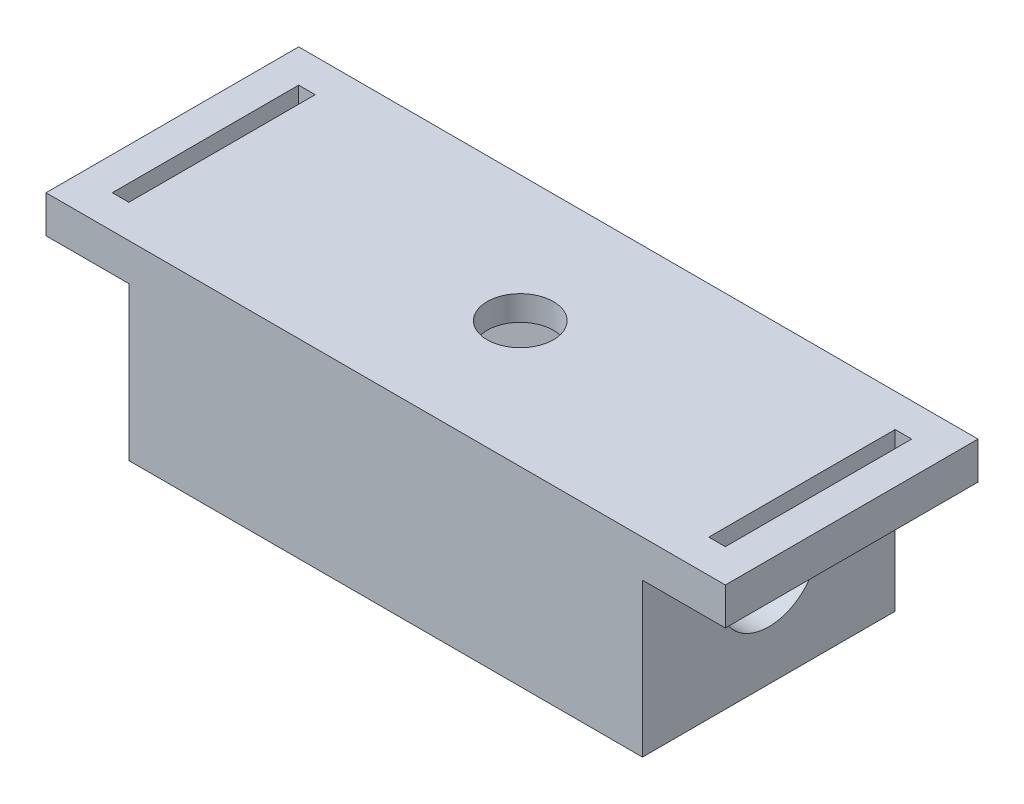
ISO-10303-21;
HEADER;
FILE_DESCRIPTION(('STEP AP214'),'2;1');
FILE_NAME('part.step','',(''),(''),'','','');
FILE_SCHEMA(('AUTOMOTIVE_DESIGN { 1 0 10303 214 1 1 1 1 }'));
ENDSEC;
DATA;
#1=APPLICATION_CONTEXT('core data for automotive mechanical design processes');
#2=APPLICATION_PROTOCOL_DEFINITION('international standard','automotive_design',2000,#1);
#3=PRODUCT_CONTEXT('',#1,'mechanical');
#4=PRODUCT('Part','Part','',(#3));
#5=PRODUCT_RELATED_PRODUCT_CATEGORY('part','',(#4));
#6=PRODUCT_DEFINITION_FORMATION('','',#4);
#7=PRODUCT_DEFINITION_CONTEXT('part definition',#1,'design');
#8=PRODUCT_DEFINITION('design','',#6,#7);
#9=PRODUCT_DEFINITION_SHAPE('','',#8);
#10=(LENGTH_UNIT() NAMED_UNIT(*) SI_UNIT(.MILLI.,.METRE.));
#11=(NAMED_UNIT(*) PLANE_ANGLE_UNIT() SI_UNIT($,.RADIAN.));
#12=(NAMED_UNIT(*) SI_UNIT($,.STERADIAN.) SOLID_ANGLE_UNIT());
#13=UNCERTAINTY_MEASURE_WITH_UNIT(LENGTH_MEASURE(1.E-05),#10,'distance_accuracy_value','');
#14=(GEOMETRIC_REPRESENTATION_CONTEXT(3) GLOBAL_UNCERTAINTY_ASSIGNED_CONTEXT((#13)) GLOBAL_UNIT_ASSIGNED_CONTEXT((#10,
#11,#12)) REPRESENTATION_CONTEXT('',''));
#15=CARTESIAN_POINT('',(0.,0.,0.));
#16=DIRECTION('',(0.,0.,1.));
#17=DIRECTION('',(1.,0.,0.));
#18=AXIS2_PLACEMENT_3D('',#15,#16,#17);
#19=CARTESIAN_POINT('',(-24.6129032258065,27.,22.9616935483871));
#20=DIRECTION('',(1.,0.,0.));
#21=DIRECTION('',(0.,0.,-1.));
#22=AXIS2_PLACEMENT_3D('',#19,#20,#21);
#23=PLANE('',#22);
#24=DIRECTION('',(0.,0.,-1.));
#25=VECTOR('',#24,1.);
#26=CARTESIAN_POINT('',(-24.6129032258065,4.,22.9616935483871));
#27=LINE('',#26,#25);
#28=CARTESIAN_POINT('',(-24.6129032258065,4.,-3.53830645161289));
#29=VERTEX_POINT('',#28);
#30=CARTESIAN_POINT('',(-24.6129032258065,4.,-7.5383064516129));
#31=VERTEX_POINT('',#30);
#32=EDGE_CURVE('E178',#29,#31,#27,.T.);
#33=ORIENTED_EDGE('',*,*,#32,.F.);
#34=DIRECTION('',(0.,-1.,0.));
#35=VECTOR('',#34,1.);
#36=CARTESIAN_POINT('',(-24.6129032258065,27.,-3.5383064516129));
#37=LINE('',#36,#35);
#38=CARTESIAN_POINT('',(-24.6129032258065,22.5,-3.5383064516129));
#39=VERTEX_POINT('',#38);
#40=EDGE_CURVE('E224',#39,#29,#37,.T.);
#41=ORIENTED_EDGE('',*,*,#40,.F.);
#42=DIRECTION('',(0.,0.,1.));
#43=VECTOR('',#42,1.);
#44=CARTESIAN_POINT('',(-24.6129032258065,22.5,-7.5383064516129));
#45=LINE('',#44,#43);
#46=CARTESIAN_POINT('',(-24.6129032258065,22.5,-7.5383064516129));
#47=VERTEX_POINT('',#46);
#48=EDGE_CURVE('E44',#47,#39,#45,.T.);
#49=ORIENTED_EDGE('',*,*,#48,.F.);
#50=DIRECTION('',(0.,-1.,0.));
#51=VECTOR('',#50,1.);
#52=CARTESIAN_POINT('',(-24.6129032258065,27.,-7.5383064516129));
#53=LINE('',#52,#51);
#54=EDGE_CURVE('E193',#47,#31,#53,.T.);
#55=ORIENTED_EDGE('',*,*,#54,.T.);
#56=EDGE_LOOP('',(#33,#41,#49,#55));
#57=FACE_BOUND('',#56,.T.);
#58=ADVANCED_FACE('F33',(#57),#23,.F.);
#59=CARTESIAN_POINT('',(-24.6129032258065,4.,22.9616935483871));
#60=VERTEX_POINT('',#59);
#61=CARTESIAN_POINT('',(-24.6129032258065,4.,18.9616935483871));
#62=VERTEX_POINT('',#61);
#63=EDGE_CURVE('E187',#60,#62,#27,.T.);
#64=ORIENTED_EDGE('',*,*,#63,.F.);
#65=DIRECTION('',(0.,-1.,0.));
#66=VECTOR('',#65,1.);
#67=CARTESIAN_POINT('',(-24.6129032258065,27.,22.9616935483871));
#68=LINE('',#67,#66);
#69=CARTESIAN_POINT('',(-24.6129032258065,22.5,22.9616935483871));
#70=VERTEX_POINT('',#69);
#71=EDGE_CURVE('E199',#70,#60,#68,.T.);
#72=ORIENTED_EDGE('',*,*,#71,.F.);
#73=CARTESIAN_POINT('',(-24.6129032258065,22.5,18.9616935483871));
#74=VERTEX_POINT('',#73);
#75=EDGE_CURVE('E11',#74,#70,#45,.T.);
#76=ORIENTED_EDGE('',*,*,#75,.F.);
#77=DIRECTION('',(0.,-1.,0.));
#78=VECTOR('',#77,1.);
#79=CARTESIAN_POINT('',(-24.6129032258065,27.,18.9616935483871));
#80=LINE('',#79,#78);
#81=EDGE_CURVE('E234',#74,#62,#80,.T.);
#82=ORIENTED_EDGE('',*,*,#81,.T.);
#83=EDGE_LOOP('',(#64,#72,#76,#82));
#84=FACE_BOUND('',#83,.T.);
#85=ADVANCED_FACE('F268',(#84),#23,.F.);
#86=CARTESIAN_POINT('',(37.3870967741935,27.,-7.5383064516129));
#87=DIRECTION('',(-1.,0.,0.));
#88=DIRECTION('',(0.,0.,1.));
#89=AXIS2_PLACEMENT_3D('',#86,#87,#88);
#90=PLANE('',#89);
#91=CARTESIAN_POINT('',(37.3870967741935,16.,7.7116935483871));
#92=DIRECTION('',(-1.,0.,0.));
#93=DIRECTION('',(0.,0.,1.));
#94=AXIS2_PLACEMENT_3D('',#91,#92,#93);
#95=CIRCLE('',#94,6.);
#96=CARTESIAN_POINT('',(37.3870967741935,16.,13.7116935483871));
#97=VERTEX_POINT('',#96);
#98=EDGE_CURVE('E37',#97,#97,#95,.T.);
#99=ORIENTED_EDGE('',*,*,#98,.T.);
#100=EDGE_LOOP('',(#99));
#101=FACE_BOUND('',#100,.T.);
#102=DIRECTION('',(0.,0.,1.));
#103=VECTOR('',#102,1.);
#104=CARTESIAN_POINT('',(37.3870967741935,4.,22.9616935483871));
#105=LINE('',#104,#103);
#106=CARTESIAN_POINT('',(37.3870967741935,4.,-7.5383064516129));
#107=VERTEX_POINT('',#106);
#108=CARTESIAN_POINT('',(37.3870967741935,4.,22.9616935483871));
#109=VERTEX_POINT('',#108);
#110=EDGE_CURVE('E52',#107,#109,#105,.T.);
#111=ORIENTED_EDGE('',*,*,#110,.F.);
#112=DIRECTION('',(0.,-1.,0.));
#113=VECTOR('',#112,1.);
#114=CARTESIAN_POINT('',(37.3870967741935,27.,-7.5383064516129));
#115=LINE('',#114,#113);
#116=CARTESIAN_POINT('',(37.3870967741935,22.5,-7.5383064516129));
#117=VERTEX_POINT('',#116);
#118=EDGE_CURVE('E196',#117,#107,#115,.T.);
#119=ORIENTED_EDGE('',*,*,#118,.F.);
#120=DIRECTION('',(0.,0.,-1.));
#121=VECTOR('',#120,1.);
#122=CARTESIAN_POINT('',(37.3870967741935,22.5,-7.5383064516129));
#123=LINE('',#122,#121);
#124=CARTESIAN_POINT('',(37.3870967741935,22.5,22.9616935483871));
#125=VERTEX_POINT('',#124);
#126=EDGE_CURVE('E614',#125,#117,#123,.T.);
#127=ORIENTED_EDGE('',*,*,#126,.F.);
#128=DIRECTION('',(0.,-1.,0.));
#129=VECTOR('',#128,1.);
#130=CARTESIAN_POINT('',(37.3870967741935,27.,22.9616935483871));
#131=LINE('',#130,#129);
#132=EDGE_CURVE('E243',#125,#109,#131,.T.);
#133=ORIENTED_EDGE('',*,*,#132,.T.);
#134=EDGE_LOOP('',(#111,#119,#127,#133));
#135=FACE_BOUND('',#134,.T.);
#136=ADVANCED_FACE('F273',(#101,#135),#90,.F.);
#137=CARTESIAN_POINT('',(-24.6129032258065,27.,18.9616935483871));
#138=DIRECTION('',(0.,0.,-1.));
#139=DIRECTION('',(-1.,0.,0.));
#140=AXIS2_PLACEMENT_3D('',#137,#138,#139);
#141=PLANE('',#140);
#142=DIRECTION('',(0.,-1.,0.));
#143=VECTOR('',#142,1.);
#144=CARTESIAN_POINT('',(33.3870967741935,27.,18.9616935483871));
#145=LINE('',#144,#143);
#146=CARTESIAN_POINT('',(33.3870967741935,24.,18.9616935483871));
#147=VERTEX_POINT('',#146);
#148=CARTESIAN_POINT('',(33.3870967741935,4.,18.9616935483871));
#149=VERTEX_POINT('',#148);
#150=EDGE_CURVE('E231',#147,#149,#145,.T.);
#151=ORIENTED_EDGE('',*,*,#150,.T.);
#152=DIRECTION('',(-1.,0.,0.));
#153=VECTOR('',#152,1.);
#154=CARTESIAN_POINT('',(-24.6129032258065,4.,18.9616935483871));
#155=LINE('',#154,#153);
#156=EDGE_CURVE('E535',#149,#62,#155,.T.);
#157=ORIENTED_EDGE('',*,*,#156,.T.);
#158=ORIENTED_EDGE('',*,*,#81,.F.);
#159=CARTESIAN_POINT('',(-24.6129032258065,24.,18.9616935483871));
#160=VERTEX_POINT('',#159);
#161=EDGE_CURVE('E235',#160,#74,#80,.T.);
#162=ORIENTED_EDGE('',*,*,#161,.F.);
#163=DIRECTION('',(1.,0.,0.));
#164=VECTOR('',#163,1.);
#165=CARTESIAN_POINT('',(-24.6129032258065,24.,18.9616935483871));
#166=LINE('',#165,#164);
#167=EDGE_CURVE('E218',#160,#147,#166,.T.);
#168=ORIENTED_EDGE('',*,*,#167,.T.);
#169=EDGE_LOOP('',(#151,#157,#158,#162,#168));
#170=FACE_BOUND('',#169,.T.);
#171=ADVANCED_FACE('F431',(#170),#141,.T.);
#172=CARTESIAN_POINT('',(33.3870967741935,27.,-3.5383064516129));
#173=DIRECTION('',(-1.,0.,0.));
#174=DIRECTION('',(0.,0.,1.));
#175=AXIS2_PLACEMENT_3D('',#172,#173,#174);
#176=PLANE('',#175);
#177=CARTESIAN_POINT('',(33.3870967741935,16.,7.7116935483871));
#178=DIRECTION('',(-1.,0.,0.));
#179=DIRECTION('',(0.,0.,1.));
#180=AXIS2_PLACEMENT_3D('',#177,#178,#179);
#181=CIRCLE('',#180,6.);
#182=CARTESIAN_POINT('',(33.3870967741935,16.,13.7116935483871));
#183=VERTEX_POINT('',#182);
#184=EDGE_CURVE('E203',#183,#183,#181,.T.);
#185=ORIENTED_EDGE('',*,*,#184,.F.);
#186=EDGE_LOOP('',(#185));
#187=FACE_BOUND('',#186,.T.);
#188=DIRECTION('',(0.,-1.,0.));
#189=VECTOR('',#188,1.);
#190=CARTESIAN_POINT('',(33.3870967741935,27.,-3.5383064516129));
#191=LINE('',#190,#189);
#192=CARTESIAN_POINT('',(33.3870967741935,24.,-3.5383064516129));
#193=VERTEX_POINT('',#192);
#194=CARTESIAN_POINT('',(33.3870967741935,4.,-3.5383064516129));
#195=VERTEX_POINT('',#194);
#196=EDGE_CURVE('E228',#193,#195,#191,.T.);
#197=ORIENTED_EDGE('',*,*,#196,.T.);
#198=DIRECTION('',(0.,0.,1.));
#199=VECTOR('',#198,1.);
#200=CARTESIAN_POINT('',(33.3870967741935,4.,-3.5383064516129));
#201=LINE('',#200,#199);
#202=EDGE_CURVE('E532',#195,#149,#201,.T.);
#203=ORIENTED_EDGE('',*,*,#202,.T.);
#204=ORIENTED_EDGE('',*,*,#150,.F.);
#205=DIRECTION('',(0.,0.,-1.));
#206=VECTOR('',#205,1.);
#207=CARTESIAN_POINT('',(33.3870967741935,24.,-3.5383064516129));
#208=LINE('',#207,#206);
#209=EDGE_CURVE('E215',#147,#193,#208,.T.);
#210=ORIENTED_EDGE('',*,*,#209,.T.);
#211=EDGE_LOOP('',(#197,#203,#204,#210));
#212=FACE_BOUND('',#211,.T.);
#213=ADVANCED_FACE('F423',(#187,#212),#176,.T.);
#214=CARTESIAN_POINT('',(-24.6129032258065,27.,-3.5383064516129));
#215=DIRECTION('',(0.,0.,1.));
#216=DIRECTION('',(1.,0.,0.));
#217=AXIS2_PLACEMENT_3D('',#214,#215,#216);
#218=PLANE('',#217);
#219=ORIENTED_EDGE('',*,*,#40,.T.);
#220=DIRECTION('',(1.,0.,0.));
#221=VECTOR('',#220,1.);
#222=CARTESIAN_POINT('',(-24.6129032258065,4.,-3.5383064516129));
#223=LINE('',#222,#221);
#224=EDGE_CURVE('E183',#29,#195,#223,.T.);
#225=ORIENTED_EDGE('',*,*,#224,.T.);
#226=ORIENTED_EDGE('',*,*,#196,.F.);
#227=DIRECTION('',(-1.,0.,0.));
#228=VECTOR('',#227,1.);
#229=CARTESIAN_POINT('',(-24.6129032258065,24.,-3.5383064516129));
#230=LINE('',#229,#228);
#231=CARTESIAN_POINT('',(-24.6129032258065,24.,-3.5383064516129));
#232=VERTEX_POINT('',#231);
#233=EDGE_CURVE('E42',#193,#232,#230,.T.);
#234=ORIENTED_EDGE('',*,*,#233,.T.);
#235=EDGE_CURVE('E225',#232,#39,#37,.T.);
#236=ORIENTED_EDGE('',*,*,#235,.T.);
#237=EDGE_LOOP('',(#219,#225,#226,#234,#236));
#238=FACE_BOUND('',#237,.T.);
#239=ADVANCED_FACE('F417',(#238),#218,.T.);
#240=CARTESIAN_POINT('',(-28.6129032258065,27.,-7.5383064516129));
#241=DIRECTION('',(0.,0.,1.));
#242=DIRECTION('',(1.,0.,0.));
#243=AXIS2_PLACEMENT_3D('',#240,#241,#242);
#244=PLANE('',#243);
#245=DIRECTION('',(1.,0.,0.));
#246=VECTOR('',#245,1.);
#247=CARTESIAN_POINT('',(-24.6129032258065,4.,-7.5383064516129));
#248=LINE('',#247,#246);
#249=EDGE_CURVE('E181',#31,#107,#248,.T.);
#250=ORIENTED_EDGE('',*,*,#249,.F.);
#251=ORIENTED_EDGE('',*,*,#54,.F.);
#252=DIRECTION('',(1.,0.,0.));
#253=VECTOR('',#252,1.);
#254=CARTESIAN_POINT('',(-34.6129032258065,22.5,-7.5383064516129));
#255=LINE('',#254,#253);
#256=CARTESIAN_POINT('',(-34.6129032258065,22.5,-7.5383064516129));
#257=VERTEX_POINT('',#256);
#258=EDGE_CURVE('E581',#257,#47,#255,.T.);
#259=ORIENTED_EDGE('',*,*,#258,.F.);
#260=DIRECTION('',(0.,-1.,0.));
#261=VECTOR('',#260,1.);
#262=CARTESIAN_POINT('',(-34.6129032258065,27.,-7.5383064516129));
#263=LINE('',#262,#261);
#264=CARTESIAN_POINT('',(-34.6129032258065,27.,-7.5383064516129));
#265=VERTEX_POINT('',#264);
#266=EDGE_CURVE('E567',#265,#257,#263,.T.);
#267=ORIENTED_EDGE('',*,*,#266,.F.);
#268=DIRECTION('',(-1.,0.,0.));
#269=VECTOR('',#268,1.);
#270=CARTESIAN_POINT('',(-28.6129032258065,27.,-7.5383064516129));
#271=LINE('',#270,#269);
#272=CARTESIAN_POINT('',(47.3870967741935,27.,-7.5383064516129));
#273=VERTEX_POINT('',#272);
#274=EDGE_CURVE('E238',#273,#265,#271,.T.);
#275=ORIENTED_EDGE('',*,*,#274,.F.);
#276=DIRECTION('',(0.,1.,0.));
#277=VECTOR('',#276,1.);
#278=CARTESIAN_POINT('',(47.3870967741935,27.,-7.5383064516129));
#279=LINE('',#278,#277);
#280=CARTESIAN_POINT('',(47.3870967741935,22.5,-7.5383064516129));
#281=VERTEX_POINT('',#280);
#282=EDGE_CURVE('E615',#281,#273,#279,.T.);
#283=ORIENTED_EDGE('',*,*,#282,.F.);
#284=DIRECTION('',(-1.,0.,0.));
#285=VECTOR('',#284,1.);
#286=CARTESIAN_POINT('',(47.3870967741935,22.5,-7.5383064516129));
#287=LINE('',#286,#285);
#288=EDGE_CURVE('E206',#281,#117,#287,.T.);
#289=ORIENTED_EDGE('',*,*,#288,.T.);
#290=ORIENTED_EDGE('',*,*,#118,.T.);
#291=EDGE_LOOP('',(#250,#251,#259,#267,#275,#283,#289,#290));
#292=FACE_BOUND('',#291,.T.);
#293=ADVANCED_FACE('F35',(#292),#244,.F.);
#294=CARTESIAN_POINT('',(-28.6129032258065,27.,22.9616935483871));
#295=DIRECTION('',(0.,0.,-1.));
#296=DIRECTION('',(-1.,0.,0.));
#297=AXIS2_PLACEMENT_3D('',#294,#295,#296);
#298=PLANE('',#297);
#299=DIRECTION('',(-1.,0.,0.));
#300=VECTOR('',#299,1.);
#301=CARTESIAN_POINT('',(-24.6129032258065,4.,22.9616935483871));
#302=LINE('',#301,#300);
#303=EDGE_CURVE('E527',#109,#60,#302,.T.);
#304=ORIENTED_EDGE('',*,*,#303,.F.);
#305=ORIENTED_EDGE('',*,*,#132,.F.);
#306=DIRECTION('',(-1.,0.,0.));
#307=VECTOR('',#306,1.);
#308=CARTESIAN_POINT('',(47.3870967741935,22.5,22.9616935483871));
#309=LINE('',#308,#307);
#310=CARTESIAN_POINT('',(47.3870967741935,22.5,22.9616935483871));
#311=VERTEX_POINT('',#310);
#312=EDGE_CURVE('E200',#311,#125,#309,.T.);
#313=ORIENTED_EDGE('',*,*,#312,.F.);
#314=DIRECTION('',(0.,-1.,0.));
#315=VECTOR('',#314,1.);
#316=CARTESIAN_POINT('',(47.3870967741935,27.,22.9616935483871));
#317=LINE('',#316,#315);
#318=CARTESIAN_POINT('',(47.3870967741935,27.,22.9616935483871));
#319=VERTEX_POINT('',#318);
#320=EDGE_CURVE('E621',#319,#311,#317,.T.);
#321=ORIENTED_EDGE('',*,*,#320,.F.);
#322=DIRECTION('',(1.,0.,0.));
#323=VECTOR('',#322,1.);
#324=CARTESIAN_POINT('',(-28.6129032258065,27.,22.9616935483871));
#325=LINE('',#324,#323);
#326=CARTESIAN_POINT('',(-34.6129032258065,27.,22.9616935483871));
#327=VERTEX_POINT('',#326);
#328=EDGE_CURVE('E240',#327,#319,#325,.T.);
#329=ORIENTED_EDGE('',*,*,#328,.F.);
#330=DIRECTION('',(0.,1.,0.));
#331=VECTOR('',#330,1.);
#332=CARTESIAN_POINT('',(-34.6129032258065,27.,22.9616935483871));
#333=LINE('',#332,#331);
#334=CARTESIAN_POINT('',(-34.6129032258065,22.5,22.9616935483871));
#335=VERTEX_POINT('',#334);
#336=EDGE_CURVE('E572',#335,#327,#333,.T.);
#337=ORIENTED_EDGE('',*,*,#336,.F.);
#338=DIRECTION('',(1.,0.,0.));
#339=VECTOR('',#338,1.);
#340=CARTESIAN_POINT('',(-34.6129032258065,22.5,22.9616935483871));
#341=LINE('',#340,#339);
#342=EDGE_CURVE('E577',#335,#70,#341,.T.);
#343=ORIENTED_EDGE('',*,*,#342,.T.);
#344=ORIENTED_EDGE('',*,*,#71,.T.);
#345=EDGE_LOOP('',(#304,#305,#313,#321,#329,#337,#343,#344));
#346=FACE_BOUND('',#345,.T.);
#347=ADVANCED_FACE('F404',(#346),#298,.F.);
#348=CARTESIAN_POINT('',(0.,27.,0.));
#349=DIRECTION('',(0.,-1.,0.));
#350=DIRECTION('',(0.,0.,-1.));
#351=AXIS2_PLACEMENT_3D('',#348,#349,#350);
#352=PLANE('',#351);
#353=DIRECTION('',(1.,0.,0.));
#354=VECTOR('',#353,1.);
#355=CARTESIAN_POINT('',(0.,27.,18.9616935483871));
#356=LINE('',#355,#354);
#357=CARTESIAN_POINT('',(41.3870967741935,27.,18.9616935483871));
#358=VERTEX_POINT('',#357);
#359=CARTESIAN_POINT('',(43.3870967741935,27.,18.9616935483871));
#360=VERTEX_POINT('',#359);
#361=EDGE_CURVE('E612',#358,#360,#356,.T.);
#362=ORIENTED_EDGE('',*,*,#361,.F.);
#363=DIRECTION('',(0.,0.,-1.));
#364=VECTOR('',#363,1.);
#365=CARTESIAN_POINT('',(41.3870967741935,27.,0.));
#366=LINE('',#365,#364);
#367=CARTESIAN_POINT('',(41.3870967741935,27.,-3.5383064516129));
#368=VERTEX_POINT('',#367);
#369=EDGE_CURVE('E604',#358,#368,#366,.T.);
#370=ORIENTED_EDGE('',*,*,#369,.T.);
#371=DIRECTION('',(1.,0.,0.));
#372=VECTOR('',#371,1.);
#373=CARTESIAN_POINT('',(0.,27.,-3.53830645161294));
#374=LINE('',#373,#372);
#375=CARTESIAN_POINT('',(43.3870967741935,27.,-3.5383064516129));
#376=VERTEX_POINT('',#375);
#377=EDGE_CURVE('E607',#368,#376,#374,.T.);
#378=ORIENTED_EDGE('',*,*,#377,.T.);
#379=DIRECTION('',(0.,0.,-1.));
#380=VECTOR('',#379,1.);
#381=CARTESIAN_POINT('',(43.3870967741935,27.,0.));
#382=LINE('',#381,#380);
#383=EDGE_CURVE('E610',#360,#376,#382,.T.);
#384=ORIENTED_EDGE('',*,*,#383,.F.);
#385=EDGE_LOOP('',(#362,#370,#378,#384));
#386=FACE_BOUND('',#385,.T.);
#387=CARTESIAN_POINT('',(7.38709677419353,27.,7.71169354838709));
#388=DIRECTION('',(0.,1.,0.));
#389=DIRECTION('',(0.,0.,1.));
#390=AXIS2_PLACEMENT_3D('',#387,#388,#389);
#391=CIRCLE('',#390,4.);
#392=CARTESIAN_POINT('',(7.38709677419353,27.,11.7116935483871));
#393=VERTEX_POINT('',#392);
#394=EDGE_CURVE('E211',#393,#393,#391,.T.);
#395=ORIENTED_EDGE('',*,*,#394,.F.);
#396=EDGE_LOOP('',(#395));
#397=FACE_BOUND('',#396,.T.);
#398=ORIENTED_EDGE('',*,*,#274,.T.);
#399=DIRECTION('',(0.,0.,-1.));
#400=VECTOR('',#399,1.);
#401=CARTESIAN_POINT('',(-34.6129032258065,27.,-7.5383064516129));
#402=LINE('',#401,#400);
#403=EDGE_CURVE('E575',#327,#265,#402,.T.);
#404=ORIENTED_EDGE('',*,*,#403,.F.);
#405=ORIENTED_EDGE('',*,*,#328,.T.);
#406=DIRECTION('',(0.,0.,1.));
#407=VECTOR('',#406,1.);
#408=CARTESIAN_POINT('',(47.3870967741935,27.,-7.5383064516129));
#409=LINE('',#408,#407);
#410=EDGE_CURVE('E618',#273,#319,#409,.T.);
#411=ORIENTED_EDGE('',*,*,#410,.F.);
#412=EDGE_LOOP('',(#398,#404,#405,#411));
#413=FACE_BOUND('',#412,.T.);
#414=DIRECTION('',(1.,0.,0.));
#415=VECTOR('',#414,1.);
#416=CARTESIAN_POINT('',(0.,27.,18.9616935483871));
#417=LINE('',#416,#415);
#418=CARTESIAN_POINT('',(-30.6129032258065,27.,18.9616935483871));
#419=VERTEX_POINT('',#418);
#420=CARTESIAN_POINT('',(-28.6129032258065,27.,18.9616935483871));
#421=VERTEX_POINT('',#420);
#422=EDGE_CURVE('E565',#419,#421,#417,.T.);
#423=ORIENTED_EDGE('',*,*,#422,.F.);
#424=DIRECTION('',(0.,0.,-1.));
#425=VECTOR('',#424,1.);
#426=CARTESIAN_POINT('',(-30.6129032258065,27.,0.));
#427=LINE('',#426,#425);
#428=CARTESIAN_POINT('',(-30.6129032258065,27.,-3.5383064516129));
#429=VERTEX_POINT('',#428);
#430=EDGE_CURVE('E557',#419,#429,#427,.T.);
#431=ORIENTED_EDGE('',*,*,#430,.T.);
#432=DIRECTION('',(1.,0.,0.));
#433=VECTOR('',#432,1.);
#434=CARTESIAN_POINT('',(0.,27.,-3.53830645161288));
#435=LINE('',#434,#433);
#436=CARTESIAN_POINT('',(-28.6129032258065,27.,-3.5383064516129));
#437=VERTEX_POINT('',#436);
#438=EDGE_CURVE('E560',#429,#437,#435,.T.);
#439=ORIENTED_EDGE('',*,*,#438,.T.);
#440=DIRECTION('',(0.,0.,-1.));
#441=VECTOR('',#440,1.);
#442=CARTESIAN_POINT('',(-28.6129032258065,27.,0.));
#443=LINE('',#442,#441);
#444=EDGE_CURVE('E563',#421,#437,#443,.T.);
#445=ORIENTED_EDGE('',*,*,#444,.F.);
#446=EDGE_LOOP('',(#423,#431,#439,#445));
#447=FACE_BOUND('',#446,.T.);
#448=ADVANCED_FACE('F302',(#386,#397,#413,#447),#352,.F.);
#449=CARTESIAN_POINT('',(-34.6129032258065,22.5,-7.5383064516129));
#450=DIRECTION('',(0.,1.,0.));
#451=DIRECTION('',(0.,0.,1.));
#452=AXIS2_PLACEMENT_3D('',#449,#450,#451);
#453=PLANE('',#452);
#454=ORIENTED_EDGE('',*,*,#48,.T.);
#455=EDGE_CURVE('E45',#39,#74,#45,.T.);
#456=ORIENTED_EDGE('',*,*,#455,.T.);
#457=ORIENTED_EDGE('',*,*,#75,.T.);
#458=ORIENTED_EDGE('',*,*,#342,.F.);
#459=DIRECTION('',(0.,0.,1.));
#460=VECTOR('',#459,1.);
#461=CARTESIAN_POINT('',(-34.6129032258065,22.5,-7.5383064516129));
#462=LINE('',#461,#460);
#463=EDGE_CURVE('E570',#257,#335,#462,.T.);
#464=ORIENTED_EDGE('',*,*,#463,.F.);
#465=ORIENTED_EDGE('',*,*,#258,.T.);
#466=EDGE_LOOP('',(#454,#456,#457,#458,#464,#465));
#467=FACE_BOUND('',#466,.T.);
#468=DIRECTION('',(1.,0.,0.));
#469=VECTOR('',#468,1.);
#470=CARTESIAN_POINT('',(-30.6129032258065,22.5,18.9616935483871));
#471=LINE('',#470,#469);
#472=CARTESIAN_POINT('',(-30.6129032258065,22.5,18.9616935483871));
#473=VERTEX_POINT('',#472);
#474=CARTESIAN_POINT('',(-28.6129032258065,22.5,18.9616935483871));
#475=VERTEX_POINT('',#474);
#476=EDGE_CURVE('E538',#473,#475,#471,.T.);
#477=ORIENTED_EDGE('',*,*,#476,.T.);
#478=DIRECTION('',(0.,0.,-1.));
#479=VECTOR('',#478,1.);
#480=CARTESIAN_POINT('',(-28.6129032258065,22.5,18.9616935483871));
#481=LINE('',#480,#479);
#482=CARTESIAN_POINT('',(-28.6129032258065,22.5,-3.5383064516129));
#483=VERTEX_POINT('',#482);
#484=EDGE_CURVE('E541',#475,#483,#481,.T.);
#485=ORIENTED_EDGE('',*,*,#484,.T.);
#486=DIRECTION('',(1.,0.,0.));
#487=VECTOR('',#486,1.);
#488=CARTESIAN_POINT('',(-30.6129032258065,22.5,-3.5383064516129));
#489=LINE('',#488,#487);
#490=CARTESIAN_POINT('',(-30.6129032258065,22.5,-3.5383064516129));
#491=VERTEX_POINT('',#490);
#492=EDGE_CURVE('E544',#491,#483,#489,.T.);
#493=ORIENTED_EDGE('',*,*,#492,.F.);
#494=DIRECTION('',(0.,0.,-1.));
#495=VECTOR('',#494,1.);
#496=CARTESIAN_POINT('',(-30.6129032258065,22.5,18.9616935483871));
#497=LINE('',#496,#495);
#498=EDGE_CURVE('E547',#473,#491,#497,.T.);
#499=ORIENTED_EDGE('',*,*,#498,.F.);
#500=EDGE_LOOP('',(#477,#485,#493,#499));
#501=FACE_BOUND('',#500,.T.);
#502=ADVANCED_FACE('F278',(#467,#501),#453,.F.);
#503=CARTESIAN_POINT('',(47.3870967741935,22.5,-7.5383064516129));
#504=DIRECTION('',(0.,1.,0.));
#505=DIRECTION('',(0.,0.,1.));
#506=AXIS2_PLACEMENT_3D('',#503,#504,#505);
#507=PLANE('',#506);
#508=ORIENTED_EDGE('',*,*,#126,.T.);
#509=ORIENTED_EDGE('',*,*,#288,.F.);
#510=DIRECTION('',(0.,0.,-1.));
#511=VECTOR('',#510,1.);
#512=CARTESIAN_POINT('',(47.3870967741935,22.5,-7.5383064516129));
#513=LINE('',#512,#511);
#514=EDGE_CURVE('E623',#311,#281,#513,.T.);
#515=ORIENTED_EDGE('',*,*,#514,.F.);
#516=ORIENTED_EDGE('',*,*,#312,.T.);
#517=EDGE_LOOP('',(#508,#509,#515,#516));
#518=FACE_BOUND('',#517,.T.);
#519=DIRECTION('',(1.,0.,0.));
#520=VECTOR('',#519,1.);
#521=CARTESIAN_POINT('',(41.3870967741935,22.5,18.9616935483871));
#522=LINE('',#521,#520);
#523=CARTESIAN_POINT('',(41.3870967741935,22.5,18.9616935483871));
#524=VERTEX_POINT('',#523);
#525=CARTESIAN_POINT('',(43.3870967741935,22.5,18.9616935483871));
#526=VERTEX_POINT('',#525);
#527=EDGE_CURVE('E583',#524,#526,#522,.T.);
#528=ORIENTED_EDGE('',*,*,#527,.T.);
#529=DIRECTION('',(0.,0.,-1.));
#530=VECTOR('',#529,1.);
#531=CARTESIAN_POINT('',(43.3870967741935,22.5,18.9616935483871));
#532=LINE('',#531,#530);
#533=CARTESIAN_POINT('',(43.3870967741935,22.5,-3.5383064516129));
#534=VERTEX_POINT('',#533);
#535=EDGE_CURVE('E586',#526,#534,#532,.T.);
#536=ORIENTED_EDGE('',*,*,#535,.T.);
#537=DIRECTION('',(1.,0.,0.));
#538=VECTOR('',#537,1.);
#539=CARTESIAN_POINT('',(41.3870967741935,22.5,-3.5383064516129));
#540=LINE('',#539,#538);
#541=CARTESIAN_POINT('',(41.3870967741935,22.5,-3.5383064516129));
#542=VERTEX_POINT('',#541);
#543=EDGE_CURVE('E589',#542,#534,#540,.T.);
#544=ORIENTED_EDGE('',*,*,#543,.F.);
#545=DIRECTION('',(0.,0.,-1.));
#546=VECTOR('',#545,1.);
#547=CARTESIAN_POINT('',(41.3870967741935,22.5,18.9616935483871));
#548=LINE('',#547,#546);
#549=EDGE_CURVE('E592',#524,#542,#548,.T.);
#550=ORIENTED_EDGE('',*,*,#549,.F.);
#551=EDGE_LOOP('',(#528,#536,#544,#550));
#552=FACE_BOUND('',#551,.T.);
#553=ADVANCED_FACE('F265',(#518,#552),#507,.F.);
#554=CARTESIAN_POINT('',(0.,24.,0.));
#555=DIRECTION('',(0.,1.,0.));
#556=DIRECTION('',(0.,0.,1.));
#557=AXIS2_PLACEMENT_3D('',#554,#555,#556);
#558=PLANE('',#557);
#559=CARTESIAN_POINT('',(7.38709677419353,24.,7.71169354838709));
#560=DIRECTION('',(0.,1.,0.));
#561=DIRECTION('',(0.,0.,1.));
#562=AXIS2_PLACEMENT_3D('',#559,#560,#561);
#563=CIRCLE('',#562,4.);
#564=CARTESIAN_POINT('',(7.38709677419353,24.,11.7116935483871));
#565=VERTEX_POINT('',#564);
#566=EDGE_CURVE('E214',#565,#565,#563,.T.);
#567=ORIENTED_EDGE('',*,*,#566,.T.);
#568=EDGE_LOOP('',(#567));
#569=FACE_BOUND('',#568,.T.);
#570=DIRECTION('',(0.,0.,1.));
#571=VECTOR('',#570,1.);
#572=CARTESIAN_POINT('',(-24.6129032258065,24.,-3.5383064516129));
#573=LINE('',#572,#571);
#574=EDGE_CURVE('E221',#232,#160,#573,.T.);
#575=ORIENTED_EDGE('',*,*,#574,.F.);
#576=ORIENTED_EDGE('',*,*,#233,.F.);
#577=ORIENTED_EDGE('',*,*,#209,.F.);
#578=ORIENTED_EDGE('',*,*,#167,.F.);
#579=EDGE_LOOP('',(#575,#576,#577,#578));
#580=FACE_BOUND('',#579,.T.);
#581=ADVANCED_FACE('F250',(#569,#580),#558,.F.);
#582=CARTESIAN_POINT('',(7.38709677419353,0.,7.71169354838709));
#583=DIRECTION('',(0.,1.,0.));
#584=DIRECTION('',(0.,0.,1.));
#585=AXIS2_PLACEMENT_3D('',#582,#583,#584);
#586=CYLINDRICAL_SURFACE('',#585,4.);
#587=ORIENTED_EDGE('',*,*,#394,.T.);
#588=EDGE_LOOP('',(#587));
#589=FACE_BOUND('',#588,.T.);
#590=ORIENTED_EDGE('',*,*,#566,.F.);
#591=EDGE_LOOP('',(#590));
#592=FACE_BOUND('',#591,.T.);
#593=ADVANCED_FACE('F253',(#589,#592),#586,.F.);
#594=CARTESIAN_POINT('',(44.3870967741935,16.,7.7116935483871));
#595=DIRECTION('',(-1.,0.,0.));
#596=DIRECTION('',(0.,0.,1.));
#597=AXIS2_PLACEMENT_3D('',#594,#595,#596);
#598=CYLINDRICAL_SURFACE('',#597,6.);
#599=ORIENTED_EDGE('',*,*,#184,.T.);
#600=EDGE_LOOP('',(#599));
#601=FACE_BOUND('',#600,.T.);
#602=ORIENTED_EDGE('',*,*,#98,.F.);
#603=EDGE_LOOP('',(#602));
#604=FACE_BOUND('',#603,.T.);
#605=ADVANCED_FACE('F255',(#601,#604),#598,.F.);
#606=CARTESIAN_POINT('',(47.3870967741935,0.,0.));
#607=DIRECTION('',(-1.,0.,0.));
#608=DIRECTION('',(0.,0.,1.));
#609=AXIS2_PLACEMENT_3D('',#606,#607,#608);
#610=PLANE('',#609);
#611=ORIENTED_EDGE('',*,*,#282,.T.);
#612=ORIENTED_EDGE('',*,*,#410,.T.);
#613=ORIENTED_EDGE('',*,*,#320,.T.);
#614=ORIENTED_EDGE('',*,*,#514,.T.);
#615=EDGE_LOOP('',(#611,#612,#613,#614));
#616=FACE_BOUND('',#615,.T.);
#617=ADVANCED_FACE('F262',(#616),#610,.F.);
#618=CARTESIAN_POINT('',(41.3870967741935,32.5,18.9616935483871));
#619=DIRECTION('',(0.,0.,-1.));
#620=DIRECTION('',(0.,1.,0.));
#621=AXIS2_PLACEMENT_3D('',#618,#619,#620);
#622=PLANE('',#621);
#623=ORIENTED_EDGE('',*,*,#361,.T.);
#624=DIRECTION('',(0.,-1.,0.));
#625=VECTOR('',#624,1.);
#626=CARTESIAN_POINT('',(43.3870967741935,32.5,18.9616935483871));
#627=LINE('',#626,#625);
#628=EDGE_CURVE('E602',#360,#526,#627,.T.);
#629=ORIENTED_EDGE('',*,*,#628,.T.);
#630=ORIENTED_EDGE('',*,*,#527,.F.);
#631=DIRECTION('',(0.,-1.,0.));
#632=VECTOR('',#631,1.);
#633=CARTESIAN_POINT('',(41.3870967741935,32.5,18.9616935483871));
#634=LINE('',#633,#632);
#635=EDGE_CURVE('E595',#358,#524,#634,.T.);
#636=ORIENTED_EDGE('',*,*,#635,.F.);
#637=EDGE_LOOP('',(#623,#629,#630,#636));
#638=FACE_BOUND('',#637,.T.);
#639=ADVANCED_FACE('F282',(#638),#622,.T.);
#640=CARTESIAN_POINT('',(43.3870967741935,32.5,18.9616935483871));
#641=DIRECTION('',(-1.,0.,0.));
#642=DIRECTION('',(0.,0.,1.));
#643=AXIS2_PLACEMENT_3D('',#640,#641,#642);
#644=PLANE('',#643);
#645=ORIENTED_EDGE('',*,*,#383,.T.);
#646=DIRECTION('',(0.,-1.,0.));
#647=VECTOR('',#646,1.);
#648=CARTESIAN_POINT('',(43.3870967741935,32.5,-3.5383064516129));
#649=LINE('',#648,#647);
#650=EDGE_CURVE('E600',#376,#534,#649,.T.);
#651=ORIENTED_EDGE('',*,*,#650,.T.);
#652=ORIENTED_EDGE('',*,*,#535,.F.);
#653=ORIENTED_EDGE('',*,*,#628,.F.);
#654=EDGE_LOOP('',(#645,#651,#652,#653));
#655=FACE_BOUND('',#654,.T.);
#656=ADVANCED_FACE('F286',(#655),#644,.T.);
#657=CARTESIAN_POINT('',(41.3870967741935,32.5,-3.5383064516129));
#658=DIRECTION('',(0.,0.,-1.));
#659=DIRECTION('',(-1.,0.,0.));
#660=AXIS2_PLACEMENT_3D('',#657,#658,#659);
#661=PLANE('',#660);
#662=DIRECTION('',(0.,-1.,0.));
#663=VECTOR('',#662,1.);
#664=CARTESIAN_POINT('',(41.3870967741935,32.5,-3.5383064516129));
#665=LINE('',#664,#663);
#666=EDGE_CURVE('E598',#368,#542,#665,.T.);
#667=ORIENTED_EDGE('',*,*,#666,.T.);
#668=ORIENTED_EDGE('',*,*,#543,.T.);
#669=ORIENTED_EDGE('',*,*,#650,.F.);
#670=ORIENTED_EDGE('',*,*,#377,.F.);
#671=EDGE_LOOP('',(#667,#668,#669,#670));
#672=FACE_BOUND('',#671,.T.);
#673=ADVANCED_FACE('F290',(#672),#661,.F.);
#674=CARTESIAN_POINT('',(41.3870967741935,32.5,18.9616935483871));
#675=DIRECTION('',(-1.,0.,0.));
#676=DIRECTION('',(0.,0.,1.));
#677=AXIS2_PLACEMENT_3D('',#674,#675,#676);
#678=PLANE('',#677);
#679=ORIENTED_EDGE('',*,*,#635,.T.);
#680=ORIENTED_EDGE('',*,*,#549,.T.);
#681=ORIENTED_EDGE('',*,*,#666,.F.);
#682=ORIENTED_EDGE('',*,*,#369,.F.);
#683=EDGE_LOOP('',(#679,#680,#681,#682));
#684=FACE_BOUND('',#683,.T.);
#685=ADVANCED_FACE('F294',(#684),#678,.F.);
#686=CARTESIAN_POINT('',(-24.6129032258065,0.,0.));
#687=DIRECTION('',(-1.,0.,0.));
#688=DIRECTION('',(0.,0.,1.));
#689=AXIS2_PLACEMENT_3D('',#686,#687,#688);
#690=PLANE('',#689);
#691=ORIENTED_EDGE('',*,*,#574,.T.);
#692=ORIENTED_EDGE('',*,*,#161,.T.);
#693=ORIENTED_EDGE('',*,*,#455,.F.);
#694=ORIENTED_EDGE('',*,*,#235,.F.);
#695=EDGE_LOOP('',(#691,#692,#693,#694));
#696=FACE_BOUND('',#695,.T.);
#697=ADVANCED_FACE('F298',(#696),#690,.F.);
#698=CARTESIAN_POINT('',(-34.6129032258065,0.,0.));
#699=DIRECTION('',(-1.,0.,0.));
#700=DIRECTION('',(0.,0.,1.));
#701=AXIS2_PLACEMENT_3D('',#698,#699,#700);
#702=PLANE('',#701);
#703=ORIENTED_EDGE('',*,*,#266,.T.);
#704=ORIENTED_EDGE('',*,*,#463,.T.);
#705=ORIENTED_EDGE('',*,*,#336,.T.);
#706=ORIENTED_EDGE('',*,*,#403,.T.);
#707=EDGE_LOOP('',(#703,#704,#705,#706));
#708=FACE_BOUND('',#707,.T.);
#709=ADVANCED_FACE('F306',(#708),#702,.T.);
#710=CARTESIAN_POINT('',(-30.6129032258065,32.5,18.9616935483871));
#711=DIRECTION('',(0.,0.,-1.));
#712=DIRECTION('',(-1.,0.,0.));
#713=AXIS2_PLACEMENT_3D('',#710,#711,#712);
#714=PLANE('',#713);
#715=ORIENTED_EDGE('',*,*,#422,.T.);
#716=DIRECTION('',(0.,-1.,0.));
#717=VECTOR('',#716,1.);
#718=CARTESIAN_POINT('',(-28.6129032258065,32.5,18.9616935483871));
#719=LINE('',#718,#717);
#720=EDGE_CURVE('E555',#421,#475,#719,.T.);
#721=ORIENTED_EDGE('',*,*,#720,.T.);
#722=ORIENTED_EDGE('',*,*,#476,.F.);
#723=DIRECTION('',(0.,-1.,0.));
#724=VECTOR('',#723,1.);
#725=CARTESIAN_POINT('',(-30.6129032258065,32.5,18.9616935483871));
#726=LINE('',#725,#724);
#727=EDGE_CURVE('E549',#419,#473,#726,.T.);
#728=ORIENTED_EDGE('',*,*,#727,.F.);
#729=EDGE_LOOP('',(#715,#721,#722,#728));
#730=FACE_BOUND('',#729,.T.);
#731=ADVANCED_FACE('F310',(#730),#714,.T.);
#732=CARTESIAN_POINT('',(-28.6129032258065,32.5,18.9616935483871));
#733=DIRECTION('',(-1.,0.,0.));
#734=DIRECTION('',(0.,0.,1.));
#735=AXIS2_PLACEMENT_3D('',#732,#733,#734);
#736=PLANE('',#735);
#737=ORIENTED_EDGE('',*,*,#444,.T.);
#738=DIRECTION('',(0.,-1.,0.));
#739=VECTOR('',#738,1.);
#740=CARTESIAN_POINT('',(-28.6129032258065,32.5,-3.5383064516129));
#741=LINE('',#740,#739);
#742=EDGE_CURVE('E553',#437,#483,#741,.T.);
#743=ORIENTED_EDGE('',*,*,#742,.T.);
#744=ORIENTED_EDGE('',*,*,#484,.F.);
#745=ORIENTED_EDGE('',*,*,#720,.F.);
#746=EDGE_LOOP('',(#737,#743,#744,#745));
#747=FACE_BOUND('',#746,.T.);
#748=ADVANCED_FACE('F314',(#747),#736,.T.);
#749=CARTESIAN_POINT('',(-30.6129032258065,32.5,-3.5383064516129));
#750=DIRECTION('',(0.,0.,-1.));
#751=DIRECTION('',(-1.,0.,0.));
#752=AXIS2_PLACEMENT_3D('',#749,#750,#751);
#753=PLANE('',#752);
#754=DIRECTION('',(0.,-1.,0.));
#755=VECTOR('',#754,1.);
#756=CARTESIAN_POINT('',(-30.6129032258065,32.5,-3.5383064516129));
#757=LINE('',#756,#755);
#758=EDGE_CURVE('E60',#429,#491,#757,.T.);
#759=ORIENTED_EDGE('',*,*,#758,.T.);
#760=ORIENTED_EDGE('',*,*,#492,.T.);
#761=ORIENTED_EDGE('',*,*,#742,.F.);
#762=ORIENTED_EDGE('',*,*,#438,.F.);
#763=EDGE_LOOP('',(#759,#760,#761,#762));
#764=FACE_BOUND('',#763,.T.);
#765=ADVANCED_FACE('F318',(#764),#753,.F.);
#766=CARTESIAN_POINT('',(-30.6129032258065,32.5,18.9616935483871));
#767=DIRECTION('',(-1.,0.,0.));
#768=DIRECTION('',(0.,0.,1.));
#769=AXIS2_PLACEMENT_3D('',#766,#767,#768);
#770=PLANE('',#769);
#771=ORIENTED_EDGE('',*,*,#727,.T.);
#772=ORIENTED_EDGE('',*,*,#498,.T.);
#773=ORIENTED_EDGE('',*,*,#758,.F.);
#774=ORIENTED_EDGE('',*,*,#430,.F.);
#775=EDGE_LOOP('',(#771,#772,#773,#774));
#776=FACE_BOUND('',#775,.T.);
#777=ADVANCED_FACE('F322',(#776),#770,.F.);
#778=CARTESIAN_POINT('',(0.,4.,0.));
#779=DIRECTION('',(0.,-1.,0.));
#780=DIRECTION('',(0.,0.,-1.));
#781=AXIS2_PLACEMENT_3D('',#778,#779,#780);
#782=PLANE('',#781);
#783=ORIENTED_EDGE('',*,*,#202,.F.);
#784=ORIENTED_EDGE('',*,*,#224,.F.);
#785=ORIENTED_EDGE('',*,*,#32,.T.);
#786=ORIENTED_EDGE('',*,*,#249,.T.);
#787=ORIENTED_EDGE('',*,*,#110,.T.);
#788=ORIENTED_EDGE('',*,*,#303,.T.);
#789=ORIENTED_EDGE('',*,*,#63,.T.);
#790=ORIENTED_EDGE('',*,*,#156,.F.);
#791=EDGE_LOOP('',(#783,#784,#785,#786,#787,#788,#789,#790));
#792=FACE_BOUND('',#791,.T.);
#793=ADVANCED_FACE('F180',(#792),#782,.T.);
#794=CLOSED_SHELL('',(#58,#85,#136,#171,#213,#239,#293,#347,#448,#502,#553,#581,#593,#605,#617,
#639,#656,#673,#685,#697,#709,#731,#748,#765,#777,#793));
#795=MANIFOLD_SOLID_BREP('B2',#794);
#796=ADVANCED_BREP_SHAPE_REPRESENTATION('',(#18,#795),#14);
#797=SHAPE_DEFINITION_REPRESENTATION(#9,#796);
ENDSEC;
END-ISO-10303-21;
